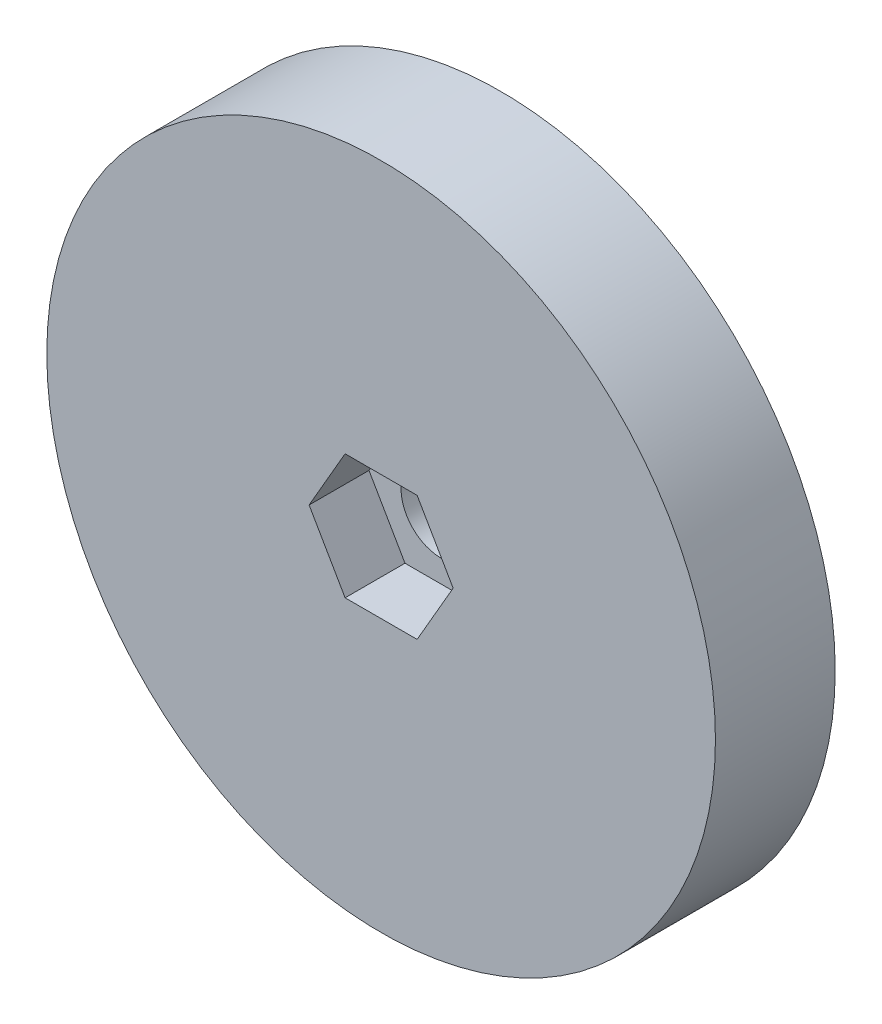
ISO-10303-21;
HEADER;
FILE_DESCRIPTION(('STEP AP214'),'2;1');
FILE_NAME('part.step','',(''),(''),'','','');
FILE_SCHEMA(('AUTOMOTIVE_DESIGN { 1 0 10303 214 1 1 1 1 }'));
ENDSEC;
DATA;
#1=APPLICATION_CONTEXT('core data for automotive mechanical design processes');
#2=APPLICATION_PROTOCOL_DEFINITION('international standard','automotive_design',2000,#1);
#3=PRODUCT_CONTEXT('',#1,'mechanical');
#4=PRODUCT('Part','Part','',(#3));
#5=PRODUCT_RELATED_PRODUCT_CATEGORY('part','',(#4));
#6=PRODUCT_DEFINITION_FORMATION('','',#4);
#7=PRODUCT_DEFINITION_CONTEXT('part definition',#1,'design');
#8=PRODUCT_DEFINITION('design','',#6,#7);
#9=PRODUCT_DEFINITION_SHAPE('','',#8);
#10=(LENGTH_UNIT() NAMED_UNIT(*) SI_UNIT(.MILLI.,.METRE.));
#11=(NAMED_UNIT(*) PLANE_ANGLE_UNIT() SI_UNIT($,.RADIAN.));
#12=(NAMED_UNIT(*) SI_UNIT($,.STERADIAN.) SOLID_ANGLE_UNIT());
#13=UNCERTAINTY_MEASURE_WITH_UNIT(LENGTH_MEASURE(1.E-05),#10,'distance_accuracy_value','');
#14=(GEOMETRIC_REPRESENTATION_CONTEXT(3) GLOBAL_UNCERTAINTY_ASSIGNED_CONTEXT((#13)) GLOBAL_UNIT_ASSIGNED_CONTEXT((#10,
#11,#12)) REPRESENTATION_CONTEXT('',''));
#15=CARTESIAN_POINT('',(0.,0.,0.));
#16=DIRECTION('',(0.,0.,1.));
#17=DIRECTION('',(1.,0.,0.));
#18=AXIS2_PLACEMENT_3D('',#15,#16,#17);
#19=CARTESIAN_POINT('',(0.,0.,12.));
#20=DIRECTION('',(0.,0.,-1.));
#21=DIRECTION('',(-1.,0.,0.));
#22=AXIS2_PLACEMENT_3D('',#19,#20,#21);
#23=CYLINDRICAL_SURFACE('',#22,4.);
#24=CARTESIAN_POINT('',(0.,0.,0.));
#25=DIRECTION('',(0.,0.,1.));
#26=DIRECTION('',(1.,0.,0.));
#27=AXIS2_PLACEMENT_3D('',#24,#25,#26);
#28=CIRCLE('',#27,4.);
#29=CARTESIAN_POINT('',(4.,0.,0.));
#30=VERTEX_POINT('',#29);
#31=EDGE_CURVE('E142',#30,#30,#28,.T.);
#32=ORIENTED_EDGE('',*,*,#31,.F.);
#33=EDGE_LOOP('',(#32));
#34=FACE_BOUND('',#33,.T.);
#35=CARTESIAN_POINT('',(0.,0.,6.));
#36=DIRECTION('',(0.,0.,1.));
#37=DIRECTION('',(1.,0.,0.));
#38=AXIS2_PLACEMENT_3D('',#35,#36,#37);
#39=CIRCLE('',#38,4.);
#40=CARTESIAN_POINT('',(4.,0.,6.));
#41=VERTEX_POINT('',#40);
#42=EDGE_CURVE('E37',#41,#41,#39,.T.);
#43=ORIENTED_EDGE('',*,*,#42,.T.);
#44=EDGE_LOOP('',(#43));
#45=FACE_BOUND('',#44,.T.);
#46=ADVANCED_FACE('F33',(#34,#45),#23,.F.);
#47=CARTESIAN_POINT('',(0.,0.,12.));
#48=DIRECTION('',(0.,0.,1.));
#49=DIRECTION('',(1.,0.,0.));
#50=AXIS2_PLACEMENT_3D('',#47,#48,#49);
#51=PLANE('',#50);
#52=DIRECTION('',(0.5,0.866025403784439,0.));
#53=VECTOR('',#52,1.);
#54=CARTESIAN_POINT('',(3.60843918243516,-6.25000000000001,12.));
#55=LINE('',#54,#53);
#56=CARTESIAN_POINT('',(3.60843918243516,-6.25000000000001,12.));
#57=VERTEX_POINT('',#56);
#58=CARTESIAN_POINT('',(7.21687836487032,0.,12.));
#59=VERTEX_POINT('',#58);
#60=EDGE_CURVE('E50',#57,#59,#55,.T.);
#61=ORIENTED_EDGE('',*,*,#60,.F.);
#62=DIRECTION('',(1.,0.,0.));
#63=VECTOR('',#62,1.);
#64=CARTESIAN_POINT('',(-3.60843918243516,-6.25000000000001,12.));
#65=LINE('',#64,#63);
#66=CARTESIAN_POINT('',(-3.60843918243516,-6.25000000000001,12.));
#67=VERTEX_POINT('',#66);
#68=EDGE_CURVE('E133',#67,#57,#65,.T.);
#69=ORIENTED_EDGE('',*,*,#68,.F.);
#70=DIRECTION('',(0.5,-0.866025403784438,0.));
#71=VECTOR('',#70,1.);
#72=CARTESIAN_POINT('',(-7.21687836487033,0.,12.));
#73=LINE('',#72,#71);
#74=CARTESIAN_POINT('',(-7.21687836487033,0.,12.));
#75=VERTEX_POINT('',#74);
#76=EDGE_CURVE('E131',#75,#67,#73,.T.);
#77=ORIENTED_EDGE('',*,*,#76,.F.);
#78=DIRECTION('',(-0.5,-0.866025403784439,0.));
#79=VECTOR('',#78,1.);
#80=CARTESIAN_POINT('',(-3.60843918243516,6.25000000000001,12.));
#81=LINE('',#80,#79);
#82=CARTESIAN_POINT('',(-3.60843918243516,6.25000000000001,12.));
#83=VERTEX_POINT('',#82);
#84=EDGE_CURVE('E98',#83,#75,#81,.T.);
#85=ORIENTED_EDGE('',*,*,#84,.F.);
#86=DIRECTION('',(-1.,0.,0.));
#87=VECTOR('',#86,1.);
#88=CARTESIAN_POINT('',(3.60843918243516,6.25000000000001,12.));
#89=LINE('',#88,#87);
#90=CARTESIAN_POINT('',(3.60843918243516,6.25000000000001,12.));
#91=VERTEX_POINT('',#90);
#92=EDGE_CURVE('E127',#91,#83,#89,.T.);
#93=ORIENTED_EDGE('',*,*,#92,.F.);
#94=DIRECTION('',(-0.5,0.866025403784439,0.));
#95=VECTOR('',#94,1.);
#96=CARTESIAN_POINT('',(7.21687836487032,0.,12.));
#97=LINE('',#96,#95);
#98=EDGE_CURVE('E124',#59,#91,#97,.T.);
#99=ORIENTED_EDGE('',*,*,#98,.F.);
#100=EDGE_LOOP('',(#61,#69,#77,#85,#93,#99));
#101=FACE_BOUND('',#100,.T.);
#102=CARTESIAN_POINT('',(0.,0.,12.));
#103=DIRECTION('',(0.,0.,1.));
#104=DIRECTION('',(1.,0.,0.));
#105=AXIS2_PLACEMENT_3D('',#102,#103,#104);
#106=CIRCLE('',#105,33.5);
#107=CARTESIAN_POINT('',(33.5,0.,12.));
#108=VERTEX_POINT('',#107);
#109=EDGE_CURVE('E11',#108,#108,#106,.T.);
#110=ORIENTED_EDGE('',*,*,#109,.T.);
#111=EDGE_LOOP('',(#110));
#112=FACE_BOUND('',#111,.T.);
#113=ADVANCED_FACE('F151',(#101,#112),#51,.T.);
#114=CARTESIAN_POINT('',(0.,0.,0.));
#115=DIRECTION('',(0.,0.,1.));
#116=DIRECTION('',(1.,0.,0.));
#117=AXIS2_PLACEMENT_3D('',#114,#115,#116);
#118=PLANE('',#117);
#119=CARTESIAN_POINT('',(0.,0.,0.));
#120=DIRECTION('',(0.,0.,1.));
#121=DIRECTION('',(1.,0.,0.));
#122=AXIS2_PLACEMENT_3D('',#119,#120,#121);
#123=CIRCLE('',#122,33.5);
#124=CARTESIAN_POINT('',(33.5,0.,0.));
#125=VERTEX_POINT('',#124);
#126=EDGE_CURVE('E42',#125,#125,#123,.T.);
#127=ORIENTED_EDGE('',*,*,#126,.F.);
#128=EDGE_LOOP('',(#127));
#129=FACE_BOUND('',#128,.T.);
#130=ORIENTED_EDGE('',*,*,#31,.T.);
#131=EDGE_LOOP('',(#130));
#132=FACE_BOUND('',#131,.T.);
#133=ADVANCED_FACE('F148',(#129,#132),#118,.F.);
#134=CARTESIAN_POINT('',(0.,0.,12.));
#135=DIRECTION('',(0.,0.,-1.));
#136=DIRECTION('',(-1.,0.,0.));
#137=AXIS2_PLACEMENT_3D('',#134,#135,#136);
#138=CYLINDRICAL_SURFACE('',#137,33.5);
#139=ORIENTED_EDGE('',*,*,#109,.F.);
#140=EDGE_LOOP('',(#139));
#141=FACE_BOUND('',#140,.T.);
#142=ORIENTED_EDGE('',*,*,#126,.T.);
#143=EDGE_LOOP('',(#142));
#144=FACE_BOUND('',#143,.T.);
#145=ADVANCED_FACE('F35',(#141,#144),#138,.T.);
#146=CARTESIAN_POINT('',(3.60843918243516,-6.25000000000001,6.));
#147=DIRECTION('',(0.866025403784439,-0.5,0.));
#148=DIRECTION('',(0.5,0.866025403784439,0.));
#149=AXIS2_PLACEMENT_3D('',#146,#147,#148);
#150=PLANE('',#149);
#151=ORIENTED_EDGE('',*,*,#60,.T.);
#152=DIRECTION('',(0.,0.,1.));
#153=VECTOR('',#152,1.);
#154=CARTESIAN_POINT('',(7.21687836487032,0.,6.));
#155=LINE('',#154,#153);
#156=CARTESIAN_POINT('',(7.21687836487032,0.,6.));
#157=VERTEX_POINT('',#156);
#158=EDGE_CURVE('E80',#157,#59,#155,.T.);
#159=ORIENTED_EDGE('',*,*,#158,.F.);
#160=DIRECTION('',(0.5,0.866025403784439,0.));
#161=VECTOR('',#160,1.);
#162=CARTESIAN_POINT('',(3.60843918243516,-6.25000000000001,6.));
#163=LINE('',#162,#161);
#164=CARTESIAN_POINT('',(3.60843918243516,-6.25000000000001,6.));
#165=VERTEX_POINT('',#164);
#166=EDGE_CURVE('E135',#165,#157,#163,.T.);
#167=ORIENTED_EDGE('',*,*,#166,.F.);
#168=DIRECTION('',(0.,0.,1.));
#169=VECTOR('',#168,1.);
#170=CARTESIAN_POINT('',(3.60843918243516,-6.25000000000001,6.));
#171=LINE('',#170,#169);
#172=EDGE_CURVE('E58',#165,#57,#171,.T.);
#173=ORIENTED_EDGE('',*,*,#172,.T.);
#174=EDGE_LOOP('',(#151,#159,#167,#173));
#175=FACE_BOUND('',#174,.T.);
#176=ADVANCED_FACE('F173',(#175),#150,.F.);
#177=CARTESIAN_POINT('',(-3.60843918243516,-6.25000000000001,6.));
#178=DIRECTION('',(0.,-1.,0.));
#179=DIRECTION('',(1.,0.,0.));
#180=AXIS2_PLACEMENT_3D('',#177,#178,#179);
#181=PLANE('',#180);
#182=ORIENTED_EDGE('',*,*,#68,.T.);
#183=ORIENTED_EDGE('',*,*,#172,.F.);
#184=DIRECTION('',(1.,0.,0.));
#185=VECTOR('',#184,1.);
#186=CARTESIAN_POINT('',(-3.60843918243516,-6.25000000000001,6.));
#187=LINE('',#186,#185);
#188=CARTESIAN_POINT('',(-3.60843918243516,-6.25000000000001,6.));
#189=VERTEX_POINT('',#188);
#190=EDGE_CURVE('E110',#189,#165,#187,.T.);
#191=ORIENTED_EDGE('',*,*,#190,.F.);
#192=DIRECTION('',(0.,0.,1.));
#193=VECTOR('',#192,1.);
#194=CARTESIAN_POINT('',(-3.60843918243516,-6.25000000000001,6.));
#195=LINE('',#194,#193);
#196=EDGE_CURVE('E102',#189,#67,#195,.T.);
#197=ORIENTED_EDGE('',*,*,#196,.T.);
#198=EDGE_LOOP('',(#182,#183,#191,#197));
#199=FACE_BOUND('',#198,.T.);
#200=ADVANCED_FACE('F170',(#199),#181,.F.);
#201=CARTESIAN_POINT('',(-7.21687836487033,0.,6.));
#202=DIRECTION('',(-0.866025403784439,-0.5,0.));
#203=DIRECTION('',(0.5,-0.866025403784439,0.));
#204=AXIS2_PLACEMENT_3D('',#201,#202,#203);
#205=PLANE('',#204);
#206=ORIENTED_EDGE('',*,*,#76,.T.);
#207=ORIENTED_EDGE('',*,*,#196,.F.);
#208=DIRECTION('',(0.5,-0.866025403784438,0.));
#209=VECTOR('',#208,1.);
#210=CARTESIAN_POINT('',(-7.21687836487033,0.,6.));
#211=LINE('',#210,#209);
#212=CARTESIAN_POINT('',(-7.21687836487033,0.,6.));
#213=VERTEX_POINT('',#212);
#214=EDGE_CURVE('E106',#213,#189,#211,.T.);
#215=ORIENTED_EDGE('',*,*,#214,.F.);
#216=DIRECTION('',(0.,0.,1.));
#217=VECTOR('',#216,1.);
#218=CARTESIAN_POINT('',(-7.21687836487033,0.,6.));
#219=LINE('',#218,#217);
#220=EDGE_CURVE('E91',#213,#75,#219,.T.);
#221=ORIENTED_EDGE('',*,*,#220,.T.);
#222=EDGE_LOOP('',(#206,#207,#215,#221));
#223=FACE_BOUND('',#222,.T.);
#224=ADVANCED_FACE('F107',(#223),#205,.F.);
#225=CARTESIAN_POINT('',(-3.60843918243516,6.25000000000001,6.));
#226=DIRECTION('',(-0.866025403784439,0.5,0.));
#227=DIRECTION('',(-0.5,-0.866025403784439,0.));
#228=AXIS2_PLACEMENT_3D('',#225,#226,#227);
#229=PLANE('',#228);
#230=ORIENTED_EDGE('',*,*,#84,.T.);
#231=ORIENTED_EDGE('',*,*,#220,.F.);
#232=DIRECTION('',(-0.5,-0.866025403784439,0.));
#233=VECTOR('',#232,1.);
#234=CARTESIAN_POINT('',(-3.60843918243516,6.25000000000001,6.));
#235=LINE('',#234,#233);
#236=CARTESIAN_POINT('',(-3.60843918243516,6.25000000000001,6.));
#237=VERTEX_POINT('',#236);
#238=EDGE_CURVE('E95',#237,#213,#235,.T.);
#239=ORIENTED_EDGE('',*,*,#238,.F.);
#240=DIRECTION('',(0.,0.,1.));
#241=VECTOR('',#240,1.);
#242=CARTESIAN_POINT('',(-3.60843918243516,6.25000000000001,6.));
#243=LINE('',#242,#241);
#244=EDGE_CURVE('E103',#237,#83,#243,.T.);
#245=ORIENTED_EDGE('',*,*,#244,.T.);
#246=EDGE_LOOP('',(#230,#231,#239,#245));
#247=FACE_BOUND('',#246,.T.);
#248=ADVANCED_FACE('F93',(#247),#229,.F.);
#249=CARTESIAN_POINT('',(3.60843918243516,6.25000000000001,6.));
#250=DIRECTION('',(0.,1.,0.));
#251=DIRECTION('',(0.,0.,1.));
#252=AXIS2_PLACEMENT_3D('',#249,#250,#251);
#253=PLANE('',#252);
#254=ORIENTED_EDGE('',*,*,#92,.T.);
#255=ORIENTED_EDGE('',*,*,#244,.F.);
#256=DIRECTION('',(-1.,0.,0.));
#257=VECTOR('',#256,1.);
#258=CARTESIAN_POINT('',(3.60843918243516,6.25000000000001,6.));
#259=LINE('',#258,#257);
#260=CARTESIAN_POINT('',(3.60843918243516,6.25000000000001,6.));
#261=VERTEX_POINT('',#260);
#262=EDGE_CURVE('E116',#261,#237,#259,.T.);
#263=ORIENTED_EDGE('',*,*,#262,.F.);
#264=DIRECTION('',(0.,0.,1.));
#265=VECTOR('',#264,1.);
#266=CARTESIAN_POINT('',(3.60843918243516,6.25000000000001,6.));
#267=LINE('',#266,#265);
#268=EDGE_CURVE('E139',#261,#91,#267,.T.);
#269=ORIENTED_EDGE('',*,*,#268,.T.);
#270=EDGE_LOOP('',(#254,#255,#263,#269));
#271=FACE_BOUND('',#270,.T.);
#272=ADVANCED_FACE('F166',(#271),#253,.F.);
#273=CARTESIAN_POINT('',(7.21687836487032,0.,6.));
#274=DIRECTION('',(0.866025403784439,0.5,0.));
#275=DIRECTION('',(-0.5,0.866025403784439,0.));
#276=AXIS2_PLACEMENT_3D('',#273,#274,#275);
#277=PLANE('',#276);
#278=ORIENTED_EDGE('',*,*,#98,.T.);
#279=ORIENTED_EDGE('',*,*,#268,.F.);
#280=DIRECTION('',(-0.5,0.866025403784439,0.));
#281=VECTOR('',#280,1.);
#282=CARTESIAN_POINT('',(7.21687836487032,0.,6.));
#283=LINE('',#282,#281);
#284=EDGE_CURVE('E118',#157,#261,#283,.T.);
#285=ORIENTED_EDGE('',*,*,#284,.F.);
#286=ORIENTED_EDGE('',*,*,#158,.T.);
#287=EDGE_LOOP('',(#278,#279,#285,#286));
#288=FACE_BOUND('',#287,.T.);
#289=ADVANCED_FACE('F161',(#288),#277,.F.);
#290=CARTESIAN_POINT('',(0.,0.,6.));
#291=DIRECTION('',(0.,0.,1.));
#292=DIRECTION('',(1.,0.,0.));
#293=AXIS2_PLACEMENT_3D('',#290,#291,#292);
#294=PLANE('',#293);
#295=ORIENTED_EDGE('',*,*,#42,.F.);
#296=EDGE_LOOP('',(#295));
#297=FACE_BOUND('',#296,.T.);
#298=ORIENTED_EDGE('',*,*,#166,.T.);
#299=ORIENTED_EDGE('',*,*,#284,.T.);
#300=ORIENTED_EDGE('',*,*,#262,.T.);
#301=ORIENTED_EDGE('',*,*,#238,.T.);
#302=ORIENTED_EDGE('',*,*,#214,.T.);
#303=ORIENTED_EDGE('',*,*,#190,.T.);
#304=EDGE_LOOP('',(#298,#299,#300,#301,#302,#303));
#305=FACE_BOUND('',#304,.T.);
#306=ADVANCED_FACE('F113',(#297,#305),#294,.T.);
#307=CLOSED_SHELL('',(#46,#113,#133,#145,#176,#200,#224,#248,#272,#289,#306));
#308=MANIFOLD_SOLID_BREP('B2',#307);
#309=ADVANCED_BREP_SHAPE_REPRESENTATION('',(#18,#308),#14);
#310=SHAPE_DEFINITION_REPRESENTATION(#9,#309);
ENDSEC;
END-ISO-10303-21;
